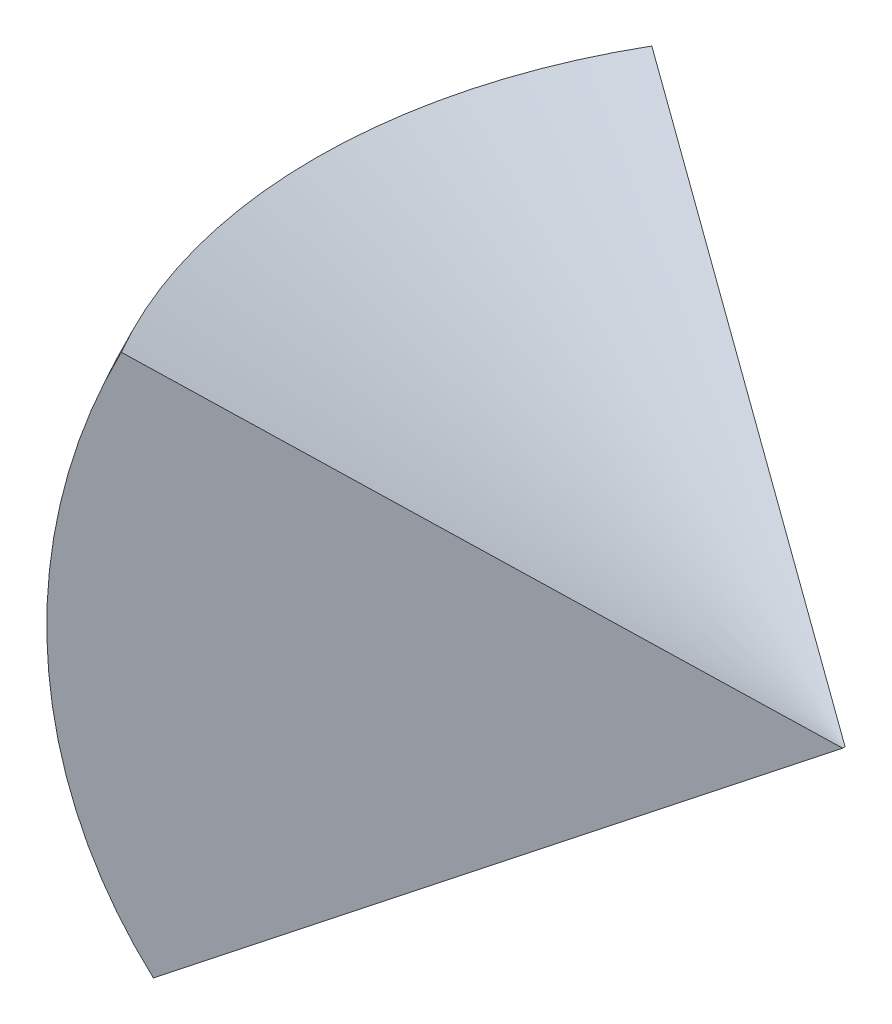
ISO-10303-21;
HEADER;
FILE_DESCRIPTION(('STEP AP214'),'2;1');
FILE_NAME('part.step','',(''),(''),'','','');
FILE_SCHEMA(('AUTOMOTIVE_DESIGN { 1 0 10303 214 1 1 1 1 }'));
ENDSEC;
DATA;
#1=APPLICATION_CONTEXT('core data for automotive mechanical design processes');
#2=APPLICATION_PROTOCOL_DEFINITION('international standard','automotive_design',2000,#1);
#3=PRODUCT_CONTEXT('',#1,'mechanical');
#4=PRODUCT('Part','Part','',(#3));
#5=PRODUCT_RELATED_PRODUCT_CATEGORY('part','',(#4));
#6=PRODUCT_DEFINITION_FORMATION('','',#4);
#7=PRODUCT_DEFINITION_CONTEXT('part definition',#1,'design');
#8=PRODUCT_DEFINITION('design','',#6,#7);
#9=PRODUCT_DEFINITION_SHAPE('','',#8);
#10=(LENGTH_UNIT() NAMED_UNIT(*) SI_UNIT(.MILLI.,.METRE.));
#11=(NAMED_UNIT(*) PLANE_ANGLE_UNIT() SI_UNIT($,.RADIAN.));
#12=(NAMED_UNIT(*) SI_UNIT($,.STERADIAN.) SOLID_ANGLE_UNIT());
#13=UNCERTAINTY_MEASURE_WITH_UNIT(LENGTH_MEASURE(1.E-05),#10,'distance_accuracy_value','');
#14=(GEOMETRIC_REPRESENTATION_CONTEXT(3) GLOBAL_UNCERTAINTY_ASSIGNED_CONTEXT((#13)) GLOBAL_UNIT_ASSIGNED_CONTEXT((#10,
#11,#12)) REPRESENTATION_CONTEXT('',''));
#15=CARTESIAN_POINT('',(0.,0.,0.));
#16=DIRECTION('',(0.,0.,1.));
#17=DIRECTION('',(1.,0.,0.));
#18=AXIS2_PLACEMENT_3D('',#15,#16,#17);
#19=CARTESIAN_POINT('',(5.44849444645479,-251.534212169712,0.));
#20=DIRECTION('',(0.,-1.,0.));
#21=DIRECTION('',(0.,0.,-1.));
#22=AXIS2_PLACEMENT_3D('',#19,#20,#21);
#23=CONICAL_SURFACE('',#22,437.732898104078,1.0471975511966);
#24=CARTESIAN_POINT('',(5.44849444645479,0.,0.));
#25=DIRECTION('',(0.,-1.,0.));
#26=DIRECTION('',(0.,0.,-1.));
#27=AXIS2_PLACEMENT_3D('',#24,#25,#26);
#28=CIRCLE('',#27,2.06286278432799);
#29=CARTESIAN_POINT('',(3.66200287070525,0.,1.031431392164));
#30=VERTEX_POINT('',#29);
#31=CARTESIAN_POINT('',(3.66200287070525,0.,-1.031431392164));
#32=VERTEX_POINT('',#31);
#33=EDGE_CURVE('E11',#30,#32,#28,.T.);
#34=ORIENTED_EDGE('',*,*,#33,.F.);
#35=DIRECTION('',(0.749999999999999,0.500000000000001,-0.43301270189222));
#36=VECTOR('',#35,1.);
#37=CARTESIAN_POINT('',(3.66200287070525,0.,1.031431392164));
#38=LINE('',#37,#36);
#39=CARTESIAN_POINT('',(-373.639315383862,-251.534212169712,218.866449052039));
#40=VERTEX_POINT('',#39);
#41=EDGE_CURVE('E78',#40,#30,#38,.T.);
#42=ORIENTED_EDGE('',*,*,#41,.F.);
#43=CARTESIAN_POINT('',(5.44849444645479,-251.534212169712,0.));
#44=DIRECTION('',(0.,-1.,0.));
#45=DIRECTION('',(0.,0.,-1.));
#46=AXIS2_PLACEMENT_3D('',#43,#44,#45);
#47=CIRCLE('',#46,437.732898104078);
#48=CARTESIAN_POINT('',(-373.639315383862,-251.534212169712,-218.86644905204));
#49=VERTEX_POINT('',#48);
#50=EDGE_CURVE('E47',#40,#49,#47,.T.);
#51=ORIENTED_EDGE('',*,*,#50,.T.);
#52=DIRECTION('',(0.749999999999999,0.500000000000001,0.43301270189222));
#53=VECTOR('',#52,1.);
#54=CARTESIAN_POINT('',(3.66200287070525,0.,-1.031431392164));
#55=LINE('',#54,#53);
#56=EDGE_CURVE('E72',#49,#32,#55,.T.);
#57=ORIENTED_EDGE('',*,*,#56,.T.);
#58=EDGE_LOOP('',(#34,#42,#51,#57));
#59=FACE_BOUND('',#58,.T.);
#60=ADVANCED_FACE('F32',(#59),#23,.F.);
#61=CARTESIAN_POINT('',(5.44849444645479,0.,0.));
#62=DIRECTION('',(0.,1.,0.));
#63=DIRECTION('',(0.,0.,1.));
#64=AXIS2_PLACEMENT_3D('',#61,#62,#63);
#65=CONICAL_SURFACE('',#64,2.06286278432799,1.13446401379631);
#66=CARTESIAN_POINT('',(5.44849444645479,212.60590303096,0.));
#67=DIRECTION('',(0.,-1.,0.));
#68=DIRECTION('',(0.,0.,-1.));
#69=AXIS2_PLACEMENT_3D('',#66,#67,#68);
#70=CIRCLE('',#69,457.997693175405);
#71=CARTESIAN_POINT('',(-391.189142718116,212.60590303096,228.998846587703));
#72=VERTEX_POINT('',#71);
#73=CARTESIAN_POINT('',(-391.189142718116,212.60590303096,-228.998846587703));
#74=VERTEX_POINT('',#73);
#75=EDGE_CURVE('E40',#72,#74,#70,.T.);
#76=ORIENTED_EDGE('',*,*,#75,.F.);
#77=DIRECTION('',(-0.784885567221395,0.4226182617407,0.453153893518326));
#78=VECTOR('',#77,1.);
#79=CARTESIAN_POINT('',(3.66200287070525,0.,1.031431392164));
#80=LINE('',#79,#78);
#81=EDGE_CURVE('E68',#30,#72,#80,.T.);
#82=ORIENTED_EDGE('',*,*,#81,.F.);
#83=ORIENTED_EDGE('',*,*,#33,.T.);
#84=DIRECTION('',(-0.784885567221395,0.4226182617407,-0.453153893518326));
#85=VECTOR('',#84,1.);
#86=CARTESIAN_POINT('',(3.66200287070525,0.,-1.031431392164));
#87=LINE('',#86,#85);
#88=EDGE_CURVE('E66',#32,#74,#87,.T.);
#89=ORIENTED_EDGE('',*,*,#88,.T.);
#90=EDGE_LOOP('',(#76,#82,#83,#89));
#91=FACE_BOUND('',#90,.T.);
#92=ADVANCED_FACE('F34',(#91),#65,.F.);
#93=CARTESIAN_POINT('',(5.44849444645479,0.,0.));
#94=DIRECTION('',(0.,-1.,0.));
#95=DIRECTION('',(0.,0.,-1.));
#96=AXIS2_PLACEMENT_3D('',#93,#94,#95);
#97=DEGENERATE_TOROIDAL_SURFACE('',#96,2.06286278432799,503.068424339423,.T.);
#98=CARTESIAN_POINT('',(3.66200287070525,0.,1.031431392164));
#99=DIRECTION('',(0.500000000000001,0.,0.866025403784438));
#100=DIRECTION('',(0.866025403784438,0.,-0.500000000000001));
#101=AXIS2_PLACEMENT_3D('',#98,#99,#100);
#102=CIRCLE('',#101,503.068424339423);
#103=EDGE_CURVE('E83',#72,#40,#102,.T.);
#104=ORIENTED_EDGE('',*,*,#103,.F.);
#105=ORIENTED_EDGE('',*,*,#75,.T.);
#106=CARTESIAN_POINT('',(3.66200287070525,0.,-1.031431392164));
#107=DIRECTION('',(-0.500000000000001,0.,0.866025403784438));
#108=DIRECTION('',(0.866025403784438,0.,0.500000000000001));
#109=AXIS2_PLACEMENT_3D('',#106,#107,#108);
#110=CIRCLE('',#109,503.068424339423);
#111=EDGE_CURVE('E76',#74,#49,#110,.T.);
#112=ORIENTED_EDGE('',*,*,#111,.T.);
#113=ORIENTED_EDGE('',*,*,#50,.F.);
#114=EDGE_LOOP('',(#104,#105,#112,#113));
#115=FACE_BOUND('',#114,.T.);
#116=ADVANCED_FACE('F86',(#115),#97,.T.);
#117=CARTESIAN_POINT('',(3.66200287070525,0.,1.031431392164));
#118=DIRECTION('',(0.500000000000001,0.,0.866025403784438));
#119=DIRECTION('',(0.866025403784438,0.,-0.500000000000001));
#120=AXIS2_PLACEMENT_3D('',#117,#118,#119);
#121=PLANE('',#120);
#122=ORIENTED_EDGE('',*,*,#41,.T.);
#123=ORIENTED_EDGE('',*,*,#81,.T.);
#124=ORIENTED_EDGE('',*,*,#103,.T.);
#125=EDGE_LOOP('',(#122,#123,#124));
#126=FACE_BOUND('',#125,.T.);
#127=ADVANCED_FACE('F88',(#126),#121,.T.);
#128=CARTESIAN_POINT('',(3.66200287070525,0.,-1.031431392164));
#129=DIRECTION('',(-0.500000000000001,0.,0.866025403784438));
#130=DIRECTION('',(0.866025403784438,0.,0.500000000000001));
#131=AXIS2_PLACEMENT_3D('',#128,#129,#130);
#132=PLANE('',#131);
#133=ORIENTED_EDGE('',*,*,#56,.F.);
#134=ORIENTED_EDGE('',*,*,#111,.F.);
#135=ORIENTED_EDGE('',*,*,#88,.F.);
#136=EDGE_LOOP('',(#133,#134,#135));
#137=FACE_BOUND('',#136,.T.);
#138=ADVANCED_FACE('F75',(#137),#132,.F.);
#139=CLOSED_SHELL('',(#60,#92,#116,#127,#138));
#140=MANIFOLD_SOLID_BREP('B2',#139);
#141=ADVANCED_BREP_SHAPE_REPRESENTATION('',(#18,#140),#14);
#142=SHAPE_DEFINITION_REPRESENTATION(#9,#141);
ENDSEC;
END-ISO-10303-21;
